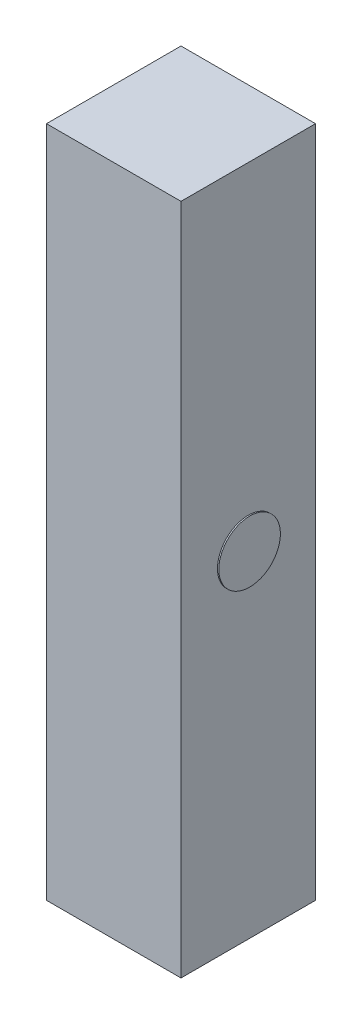
ISO-10303-21;
HEADER;
FILE_DESCRIPTION(('STEP AP214'),'2;1');
FILE_NAME('part.step','',(''),(''),'','','');
FILE_SCHEMA(('AUTOMOTIVE_DESIGN { 1 0 10303 214 1 1 1 1 }'));
ENDSEC;
DATA;
#1=APPLICATION_CONTEXT('core data for automotive mechanical design processes');
#2=APPLICATION_PROTOCOL_DEFINITION('international standard','automotive_design',2000,#1);
#3=PRODUCT_CONTEXT('',#1,'mechanical');
#4=PRODUCT('Part','Part','',(#3));
#5=PRODUCT_RELATED_PRODUCT_CATEGORY('part','',(#4));
#6=PRODUCT_DEFINITION_FORMATION('','',#4);
#7=PRODUCT_DEFINITION_CONTEXT('part definition',#1,'design');
#8=PRODUCT_DEFINITION('design','',#6,#7);
#9=PRODUCT_DEFINITION_SHAPE('','',#8);
#10=(LENGTH_UNIT() NAMED_UNIT(*) SI_UNIT(.MILLI.,.METRE.));
#11=(NAMED_UNIT(*) PLANE_ANGLE_UNIT() SI_UNIT($,.RADIAN.));
#12=(NAMED_UNIT(*) SI_UNIT($,.STERADIAN.) SOLID_ANGLE_UNIT());
#13=UNCERTAINTY_MEASURE_WITH_UNIT(LENGTH_MEASURE(1.E-05),#10,'distance_accuracy_value','');
#14=(GEOMETRIC_REPRESENTATION_CONTEXT(3) GLOBAL_UNCERTAINTY_ASSIGNED_CONTEXT((#13)) GLOBAL_UNIT_ASSIGNED_CONTEXT((#10,
#11,#12)) REPRESENTATION_CONTEXT('',''));
#15=CARTESIAN_POINT('',(0.,0.,0.));
#16=DIRECTION('',(0.,0.,1.));
#17=DIRECTION('',(1.,0.,0.));
#18=AXIS2_PLACEMENT_3D('',#15,#16,#17);
#19=CARTESIAN_POINT('',(0.,0.,1.));
#20=DIRECTION('',(1.,0.,0.));
#21=DIRECTION('',(0.,1.,0.));
#22=AXIS2_PLACEMENT_3D('',#19,#20,#21);
#23=PLANE('',#22);
#24=DIRECTION('',(0.,-1.,0.));
#25=VECTOR('',#24,1.);
#26=CARTESIAN_POINT('',(0.,0.,0.));
#27=LINE('',#26,#25);
#28=CARTESIAN_POINT('',(0.,0.,0.));
#29=VERTEX_POINT('',#28);
#30=CARTESIAN_POINT('',(0.,-5.,0.));
#31=VERTEX_POINT('',#30);
#32=EDGE_CURVE('E99',#29,#31,#27,.T.);
#33=ORIENTED_EDGE('',*,*,#32,.T.);
#34=DIRECTION('',(0.,0.,-1.));
#35=VECTOR('',#34,1.);
#36=CARTESIAN_POINT('',(0.,-5.,1.));
#37=LINE('',#36,#35);
#38=CARTESIAN_POINT('',(0.,-5.,1.));
#39=VERTEX_POINT('',#38);
#40=EDGE_CURVE('E41',#39,#31,#37,.T.);
#41=ORIENTED_EDGE('',*,*,#40,.F.);
#42=DIRECTION('',(0.,-1.,0.));
#43=VECTOR('',#42,1.);
#44=CARTESIAN_POINT('',(0.,0.,1.));
#45=LINE('',#44,#43);
#46=CARTESIAN_POINT('',(0.,0.,1.));
#47=VERTEX_POINT('',#46);
#48=EDGE_CURVE('E85',#47,#39,#45,.T.);
#49=ORIENTED_EDGE('',*,*,#48,.F.);
#50=DIRECTION('',(0.,0.,-1.));
#51=VECTOR('',#50,1.);
#52=CARTESIAN_POINT('',(0.,0.,1.));
#53=LINE('',#52,#51);
#54=EDGE_CURVE('E95',#47,#29,#53,.T.);
#55=ORIENTED_EDGE('',*,*,#54,.T.);
#56=EDGE_LOOP('',(#33,#41,#49,#55));
#57=FACE_BOUND('',#56,.T.);
#58=ADVANCED_FACE('F33',(#57),#23,.F.);
#59=CARTESIAN_POINT('',(0.,-5.,1.));
#60=DIRECTION('',(0.,1.,0.));
#61=DIRECTION('',(0.,0.,1.));
#62=AXIS2_PLACEMENT_3D('',#59,#60,#61);
#63=PLANE('',#62);
#64=DIRECTION('',(1.,0.,0.));
#65=VECTOR('',#64,1.);
#66=CARTESIAN_POINT('',(0.,-5.,0.));
#67=LINE('',#66,#65);
#68=CARTESIAN_POINT('',(1.,-5.,0.));
#69=VERTEX_POINT('',#68);
#70=EDGE_CURVE('E90',#31,#69,#67,.T.);
#71=ORIENTED_EDGE('',*,*,#70,.T.);
#72=DIRECTION('',(0.,0.,-1.));
#73=VECTOR('',#72,1.);
#74=CARTESIAN_POINT('',(1.,-5.,1.));
#75=LINE('',#74,#73);
#76=CARTESIAN_POINT('',(1.,-5.,1.));
#77=VERTEX_POINT('',#76);
#78=EDGE_CURVE('E88',#77,#69,#75,.T.);
#79=ORIENTED_EDGE('',*,*,#78,.F.);
#80=DIRECTION('',(1.,0.,0.));
#81=VECTOR('',#80,1.);
#82=CARTESIAN_POINT('',(0.,-5.,1.));
#83=LINE('',#82,#81);
#84=EDGE_CURVE('E80',#39,#77,#83,.T.);
#85=ORIENTED_EDGE('',*,*,#84,.F.);
#86=ORIENTED_EDGE('',*,*,#40,.T.);
#87=EDGE_LOOP('',(#71,#79,#85,#86));
#88=FACE_BOUND('',#87,.T.);
#89=ADVANCED_FACE('F89',(#88),#63,.F.);
#90=CARTESIAN_POINT('',(1.,0.,1.));
#91=DIRECTION('',(-1.,0.,0.));
#92=DIRECTION('',(0.,-1.,0.));
#93=AXIS2_PLACEMENT_3D('',#90,#91,#92);
#94=PLANE('',#93);
#95=CARTESIAN_POINT('',(1.,-2.5,0.5));
#96=DIRECTION('',(-1.,0.,0.));
#97=DIRECTION('',(0.,-1.,0.));
#98=AXIS2_PLACEMENT_3D('',#95,#96,#97);
#99=CIRCLE('',#98,0.228902053623415);
#100=CARTESIAN_POINT('',(1.,-2.72890205362341,0.5));
#101=VERTEX_POINT('',#100);
#102=EDGE_CURVE('E11',#101,#101,#99,.F.);
#103=ORIENTED_EDGE('',*,*,#102,.F.);
#104=EDGE_LOOP('',(#103));
#105=FACE_BOUND('',#104,.T.);
#106=DIRECTION('',(0.,1.,0.));
#107=VECTOR('',#106,1.);
#108=CARTESIAN_POINT('',(1.,0.,0.));
#109=LINE('',#108,#107);
#110=CARTESIAN_POINT('',(1.,0.,0.));
#111=VERTEX_POINT('',#110);
#112=EDGE_CURVE('E66',#69,#111,#109,.T.);
#113=ORIENTED_EDGE('',*,*,#112,.T.);
#114=DIRECTION('',(0.,0.,-1.));
#115=VECTOR('',#114,1.);
#116=CARTESIAN_POINT('',(1.,0.,1.));
#117=LINE('',#116,#115);
#118=CARTESIAN_POINT('',(1.,0.,1.));
#119=VERTEX_POINT('',#118);
#120=EDGE_CURVE('E91',#119,#111,#117,.T.);
#121=ORIENTED_EDGE('',*,*,#120,.F.);
#122=DIRECTION('',(0.,1.,0.));
#123=VECTOR('',#122,1.);
#124=CARTESIAN_POINT('',(1.,0.,1.));
#125=LINE('',#124,#123);
#126=EDGE_CURVE('E83',#77,#119,#125,.T.);
#127=ORIENTED_EDGE('',*,*,#126,.F.);
#128=ORIENTED_EDGE('',*,*,#78,.T.);
#129=EDGE_LOOP('',(#113,#121,#127,#128));
#130=FACE_BOUND('',#129,.T.);
#131=ADVANCED_FACE('F93',(#105,#130),#94,.F.);
#132=CARTESIAN_POINT('',(0.,0.,1.));
#133=DIRECTION('',(0.,-1.,0.));
#134=DIRECTION('',(0.,0.,-1.));
#135=AXIS2_PLACEMENT_3D('',#132,#133,#134);
#136=PLANE('',#135);
#137=DIRECTION('',(-1.,0.,0.));
#138=VECTOR('',#137,1.);
#139=CARTESIAN_POINT('',(0.,0.,0.));
#140=LINE('',#139,#138);
#141=EDGE_CURVE('E72',#111,#29,#140,.T.);
#142=ORIENTED_EDGE('',*,*,#141,.T.);
#143=ORIENTED_EDGE('',*,*,#54,.F.);
#144=DIRECTION('',(-1.,0.,0.));
#145=VECTOR('',#144,1.);
#146=CARTESIAN_POINT('',(0.,0.,1.));
#147=LINE('',#146,#145);
#148=EDGE_CURVE('E49',#119,#47,#147,.T.);
#149=ORIENTED_EDGE('',*,*,#148,.F.);
#150=ORIENTED_EDGE('',*,*,#120,.T.);
#151=EDGE_LOOP('',(#142,#143,#149,#150));
#152=FACE_BOUND('',#151,.T.);
#153=ADVANCED_FACE('F121',(#152),#136,.F.);
#154=CARTESIAN_POINT('',(0.,0.,1.));
#155=DIRECTION('',(0.,0.,1.));
#156=DIRECTION('',(1.,0.,0.));
#157=AXIS2_PLACEMENT_3D('',#154,#155,#156);
#158=PLANE('',#157);
#159=ORIENTED_EDGE('',*,*,#48,.T.);
#160=ORIENTED_EDGE('',*,*,#84,.T.);
#161=ORIENTED_EDGE('',*,*,#126,.T.);
#162=ORIENTED_EDGE('',*,*,#148,.T.);
#163=EDGE_LOOP('',(#159,#160,#161,#162));
#164=FACE_BOUND('',#163,.T.);
#165=ADVANCED_FACE('F81',(#164),#158,.T.);
#166=CARTESIAN_POINT('',(0.,0.,0.));
#167=DIRECTION('',(0.,0.,1.));
#168=DIRECTION('',(1.,0.,0.));
#169=AXIS2_PLACEMENT_3D('',#166,#167,#168);
#170=PLANE('',#169);
#171=ORIENTED_EDGE('',*,*,#32,.F.);
#172=ORIENTED_EDGE('',*,*,#141,.F.);
#173=ORIENTED_EDGE('',*,*,#112,.F.);
#174=ORIENTED_EDGE('',*,*,#70,.F.);
#175=EDGE_LOOP('',(#171,#172,#173,#174));
#176=FACE_BOUND('',#175,.T.);
#177=ADVANCED_FACE('F110',(#176),#170,.F.);
#178=CARTESIAN_POINT('',(1.01,-2.5,0.5));
#179=DIRECTION('',(-1.,0.,0.));
#180=DIRECTION('',(0.,-1.,0.));
#181=AXIS2_PLACEMENT_3D('',#178,#179,#180);
#182=CYLINDRICAL_SURFACE('',#181,0.228902053623415);
#183=CARTESIAN_POINT('',(1.01,-2.5,0.5));
#184=DIRECTION('',(1.,0.,0.));
#185=DIRECTION('',(0.,1.,0.));
#186=AXIS2_PLACEMENT_3D('',#183,#184,#185);
#187=CIRCLE('',#186,0.228902053623415);
#188=CARTESIAN_POINT('',(1.01,-2.27109794637658,0.5));
#189=VERTEX_POINT('',#188);
#190=EDGE_CURVE('E102',#189,#189,#187,.T.);
#191=ORIENTED_EDGE('',*,*,#190,.F.);
#192=EDGE_LOOP('',(#191));
#193=FACE_BOUND('',#192,.T.);
#194=ORIENTED_EDGE('',*,*,#102,.T.);
#195=EDGE_LOOP('',(#194));
#196=FACE_BOUND('',#195,.T.);
#197=ADVANCED_FACE('F112',(#193,#196),#182,.T.);
#198=CARTESIAN_POINT('',(1.01,-2.5,0.5));
#199=DIRECTION('',(1.,0.,0.));
#200=DIRECTION('',(0.,1.,0.));
#201=AXIS2_PLACEMENT_3D('',#198,#199,#200);
#202=PLANE('',#201);
#203=ORIENTED_EDGE('',*,*,#190,.T.);
#204=EDGE_LOOP('',(#203));
#205=FACE_BOUND('',#204,.T.);
#206=ADVANCED_FACE('F118',(#205),#202,.T.);
#207=CLOSED_SHELL('',(#58,#89,#131,#153,#165,#177,#197,#206));
#208=MANIFOLD_SOLID_BREP('B2',#207);
#209=ADVANCED_BREP_SHAPE_REPRESENTATION('',(#18,#208),#14);
#210=SHAPE_DEFINITION_REPRESENTATION(#9,#209);
ENDSEC;
END-ISO-10303-21;
